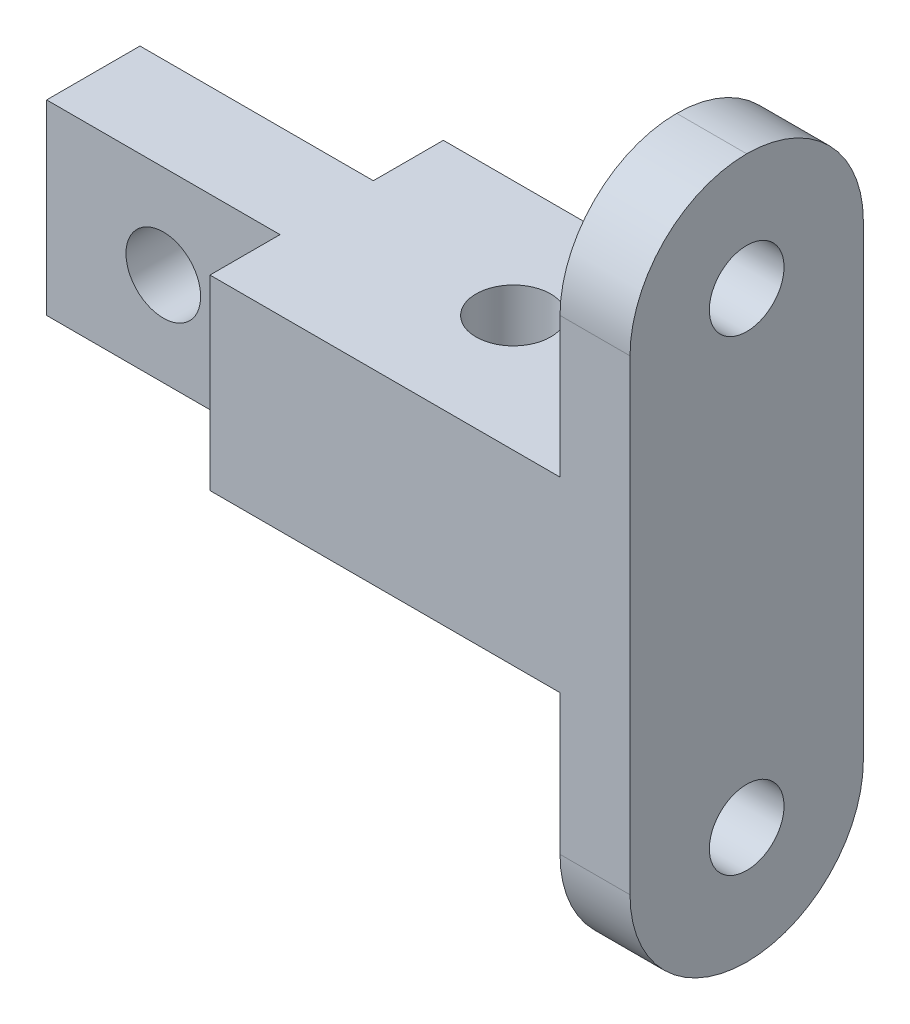
ISO-10303-21;
HEADER;
FILE_DESCRIPTION(('STEP AP214'),'2;1');
FILE_NAME('part.step','',(''),(''),'','','');
FILE_SCHEMA(('AUTOMOTIVE_DESIGN { 1 0 10303 214 1 1 1 1 }'));
ENDSEC;
DATA;
#1=APPLICATION_CONTEXT('core data for automotive mechanical design processes');
#2=APPLICATION_PROTOCOL_DEFINITION('international standard','automotive_design',2000,#1);
#3=PRODUCT_CONTEXT('',#1,'mechanical');
#4=PRODUCT('Part','Part','',(#3));
#5=PRODUCT_RELATED_PRODUCT_CATEGORY('part','',(#4));
#6=PRODUCT_DEFINITION_FORMATION('','',#4);
#7=PRODUCT_DEFINITION_CONTEXT('part definition',#1,'design');
#8=PRODUCT_DEFINITION('design','',#6,#7);
#9=PRODUCT_DEFINITION_SHAPE('','',#8);
#10=(LENGTH_UNIT() NAMED_UNIT(*) SI_UNIT(.MILLI.,.METRE.));
#11=(NAMED_UNIT(*) PLANE_ANGLE_UNIT() SI_UNIT($,.RADIAN.));
#12=(NAMED_UNIT(*) SI_UNIT($,.STERADIAN.) SOLID_ANGLE_UNIT());
#13=UNCERTAINTY_MEASURE_WITH_UNIT(LENGTH_MEASURE(1.E-05),#10,'distance_accuracy_value','');
#14=(GEOMETRIC_REPRESENTATION_CONTEXT(3) GLOBAL_UNCERTAINTY_ASSIGNED_CONTEXT((#13)) GLOBAL_UNIT_ASSIGNED_CONTEXT((#10,
#11,#12)) REPRESENTATION_CONTEXT('',''));
#15=CARTESIAN_POINT('',(0.,0.,0.));
#16=DIRECTION('',(0.,0.,1.));
#17=DIRECTION('',(1.,0.,0.));
#18=AXIS2_PLACEMENT_3D('',#15,#16,#17);
#19=CARTESIAN_POINT('',(6.,15.,10.));
#20=DIRECTION('',(1.,0.,0.));
#21=DIRECTION('',(0.,1.,0.));
#22=AXIS2_PLACEMENT_3D('',#19,#20,#21);
#23=PLANE('',#22);
#24=CARTESIAN_POINT('',(6.,10.,5.));
#25=DIRECTION('',(-1.,0.,0.));
#26=DIRECTION('',(0.,-1.,0.));
#27=AXIS2_PLACEMENT_3D('',#24,#25,#26);
#28=CIRCLE('',#27,1.6);
#29=CARTESIAN_POINT('',(6.,8.4,5.));
#30=VERTEX_POINT('',#29);
#31=EDGE_CURVE('E193',#30,#30,#28,.T.);
#32=ORIENTED_EDGE('',*,*,#31,.F.);
#33=EDGE_LOOP('',(#32));
#34=FACE_BOUND('',#33,.T.);
#35=CARTESIAN_POINT('',(6.,10.,5.));
#36=DIRECTION('',(1.,0.,0.));
#37=DIRECTION('',(0.,1.,0.));
#38=AXIS2_PLACEMENT_3D('',#35,#36,#37);
#39=CIRCLE('',#38,5.);
#40=CARTESIAN_POINT('',(6.,10.,10.));
#41=VERTEX_POINT('',#40);
#42=CARTESIAN_POINT('',(6.,15.,5.));
#43=VERTEX_POINT('',#42);
#44=EDGE_CURVE('E219',#41,#43,#39,.F.);
#45=ORIENTED_EDGE('',*,*,#44,.T.);
#46=CARTESIAN_POINT('',(6.,10.,5.));
#47=DIRECTION('',(1.,0.,0.));
#48=DIRECTION('',(0.,1.,0.));
#49=AXIS2_PLACEMENT_3D('',#46,#47,#48);
#50=CIRCLE('',#49,5.);
#51=CARTESIAN_POINT('',(6.,10.,0.));
#52=VERTEX_POINT('',#51);
#53=EDGE_CURVE('E221',#43,#52,#50,.F.);
#54=ORIENTED_EDGE('',*,*,#53,.T.);
#55=DIRECTION('',(0.,-1.,0.));
#56=VECTOR('',#55,1.);
#57=CARTESIAN_POINT('',(6.,15.,0.));
#58=LINE('',#57,#56);
#59=CARTESIAN_POINT('',(6.,4.,0.));
#60=VERTEX_POINT('',#59);
#61=EDGE_CURVE('E169',#52,#60,#58,.T.);
#62=ORIENTED_EDGE('',*,*,#61,.T.);
#63=DIRECTION('',(0.,0.,-1.));
#64=VECTOR('',#63,1.);
#65=CARTESIAN_POINT('',(6.,4.,10.));
#66=LINE('',#65,#64);
#67=CARTESIAN_POINT('',(6.,4.,10.));
#68=VERTEX_POINT('',#67);
#69=EDGE_CURVE('E188',#68,#60,#66,.T.);
#70=ORIENTED_EDGE('',*,*,#69,.F.);
#71=DIRECTION('',(0.,-1.,0.));
#72=VECTOR('',#71,1.);
#73=CARTESIAN_POINT('',(6.,15.,10.));
#74=LINE('',#73,#72);
#75=EDGE_CURVE('E154',#41,#68,#74,.T.);
#76=ORIENTED_EDGE('',*,*,#75,.F.);
#77=EDGE_LOOP('',(#45,#54,#62,#70,#76));
#78=FACE_BOUND('',#77,.T.);
#79=ADVANCED_FACE('F33',(#34,#78),#23,.F.);
#80=CARTESIAN_POINT('',(6.,4.,10.));
#81=DIRECTION('',(0.,-1.,0.));
#82=DIRECTION('',(1.,0.,0.));
#83=AXIS2_PLACEMENT_3D('',#80,#81,#82);
#84=PLANE('',#83);
#85=CARTESIAN_POINT('',(-1.,4.,5.));
#86=DIRECTION('',(0.,-1.,0.));
#87=DIRECTION('',(1.,0.,0.));
#88=AXIS2_PLACEMENT_3D('',#85,#86,#87);
#89=CIRCLE('',#88,1.6);
#90=CARTESIAN_POINT('',(0.599999999999997,4.,5.));
#91=VERTEX_POINT('',#90);
#92=EDGE_CURVE('E307',#91,#91,#89,.T.);
#93=ORIENTED_EDGE('',*,*,#92,.T.);
#94=EDGE_LOOP('',(#93));
#95=FACE_BOUND('',#94,.T.);
#96=DIRECTION('',(0.,0.,-1.));
#97=VECTOR('',#96,1.);
#98=CARTESIAN_POINT('',(-19.,4.,10.));
#99=LINE('',#98,#97);
#100=CARTESIAN_POINT('',(-19.,4.,7.));
#101=VERTEX_POINT('',#100);
#102=CARTESIAN_POINT('',(-19.,4.,3.));
#103=VERTEX_POINT('',#102);
#104=EDGE_CURVE('E186',#101,#103,#99,.T.);
#105=ORIENTED_EDGE('',*,*,#104,.F.);
#106=DIRECTION('',(-1.,0.,0.));
#107=VECTOR('',#106,1.);
#108=CARTESIAN_POINT('',(-19.,4.,7.));
#109=LINE('',#108,#107);
#110=CARTESIAN_POINT('',(-9.,4.,7.));
#111=VERTEX_POINT('',#110);
#112=EDGE_CURVE('E150',#111,#101,#109,.T.);
#113=ORIENTED_EDGE('',*,*,#112,.F.);
#114=DIRECTION('',(0.,0.,-1.));
#115=VECTOR('',#114,1.);
#116=CARTESIAN_POINT('',(-9.,4.,10.));
#117=LINE('',#116,#115);
#118=CARTESIAN_POINT('',(-9.,4.,10.));
#119=VERTEX_POINT('',#118);
#120=EDGE_CURVE('E136',#119,#111,#117,.T.);
#121=ORIENTED_EDGE('',*,*,#120,.F.);
#122=DIRECTION('',(-1.,0.,0.));
#123=VECTOR('',#122,1.);
#124=CARTESIAN_POINT('',(6.,4.,10.));
#125=LINE('',#124,#123);
#126=EDGE_CURVE('E148',#68,#119,#125,.T.);
#127=ORIENTED_EDGE('',*,*,#126,.F.);
#128=ORIENTED_EDGE('',*,*,#69,.T.);
#129=DIRECTION('',(-1.,0.,0.));
#130=VECTOR('',#129,1.);
#131=CARTESIAN_POINT('',(6.,4.,0.));
#132=LINE('',#131,#130);
#133=CARTESIAN_POINT('',(-9.,4.,0.));
#134=VERTEX_POINT('',#133);
#135=EDGE_CURVE('E171',#60,#134,#132,.T.);
#136=ORIENTED_EDGE('',*,*,#135,.T.);
#137=DIRECTION('',(0.,0.,-1.));
#138=VECTOR('',#137,1.);
#139=CARTESIAN_POINT('',(-9.,4.,0.));
#140=LINE('',#139,#138);
#141=CARTESIAN_POINT('',(-9.,4.,3.));
#142=VERTEX_POINT('',#141);
#143=EDGE_CURVE('E57',#142,#134,#140,.T.);
#144=ORIENTED_EDGE('',*,*,#143,.F.);
#145=DIRECTION('',(1.,0.,0.));
#146=VECTOR('',#145,1.);
#147=CARTESIAN_POINT('',(-19.,4.,3.));
#148=LINE('',#147,#146);
#149=EDGE_CURVE('E253',#103,#142,#148,.T.);
#150=ORIENTED_EDGE('',*,*,#149,.F.);
#151=EDGE_LOOP('',(#105,#113,#121,#127,#128,#136,#144,#150));
#152=FACE_BOUND('',#151,.T.);
#153=ADVANCED_FACE('F146',(#95,#152),#84,.F.);
#154=CARTESIAN_POINT('',(-19.,-4.,10.));
#155=DIRECTION('',(1.,0.,0.));
#156=DIRECTION('',(0.,0.,-1.));
#157=AXIS2_PLACEMENT_3D('',#154,#155,#156);
#158=PLANE('',#157);
#159=DIRECTION('',(0.,0.,-1.));
#160=VECTOR('',#159,1.);
#161=CARTESIAN_POINT('',(-19.,-4.,10.));
#162=LINE('',#161,#160);
#163=CARTESIAN_POINT('',(-19.,-4.,7.));
#164=VERTEX_POINT('',#163);
#165=CARTESIAN_POINT('',(-19.,-4.,3.));
#166=VERTEX_POINT('',#165);
#167=EDGE_CURVE('E184',#164,#166,#162,.T.);
#168=ORIENTED_EDGE('',*,*,#167,.F.);
#169=DIRECTION('',(0.,1.,0.));
#170=VECTOR('',#169,1.);
#171=CARTESIAN_POINT('',(-19.,-6.,7.));
#172=LINE('',#171,#170);
#173=EDGE_CURVE('E297',#164,#101,#172,.T.);
#174=ORIENTED_EDGE('',*,*,#173,.T.);
#175=ORIENTED_EDGE('',*,*,#104,.T.);
#176=DIRECTION('',(0.,1.,0.));
#177=VECTOR('',#176,1.);
#178=CARTESIAN_POINT('',(-19.,-6.,3.));
#179=LINE('',#178,#177);
#180=EDGE_CURVE('E245',#166,#103,#179,.T.);
#181=ORIENTED_EDGE('',*,*,#180,.F.);
#182=EDGE_LOOP('',(#168,#174,#175,#181));
#183=FACE_BOUND('',#182,.T.);
#184=ADVANCED_FACE('F249',(#183),#158,.F.);
#185=CARTESIAN_POINT('',(6.,-4.,10.));
#186=DIRECTION('',(0.,1.,0.));
#187=DIRECTION('',(-1.,0.,0.));
#188=AXIS2_PLACEMENT_3D('',#185,#186,#187);
#189=PLANE('',#188);
#190=CARTESIAN_POINT('',(-1.,-4.,5.));
#191=DIRECTION('',(0.,-1.,0.));
#192=DIRECTION('',(1.,0.,0.));
#193=AXIS2_PLACEMENT_3D('',#190,#191,#192);
#194=CIRCLE('',#193,1.6);
#195=CARTESIAN_POINT('',(0.599999999999998,-4.,5.));
#196=VERTEX_POINT('',#195);
#197=EDGE_CURVE('E310',#196,#196,#194,.T.);
#198=ORIENTED_EDGE('',*,*,#197,.F.);
#199=EDGE_LOOP('',(#198));
#200=FACE_BOUND('',#199,.T.);
#201=DIRECTION('',(0.,0.,-1.));
#202=VECTOR('',#201,1.);
#203=CARTESIAN_POINT('',(-9.,-4.,10.));
#204=LINE('',#203,#202);
#205=CARTESIAN_POINT('',(-9.,-4.,10.));
#206=VERTEX_POINT('',#205);
#207=CARTESIAN_POINT('',(-9.,-4.,7.));
#208=VERTEX_POINT('',#207);
#209=EDGE_CURVE('E49',#206,#208,#204,.T.);
#210=ORIENTED_EDGE('',*,*,#209,.T.);
#211=DIRECTION('',(-1.,0.,0.));
#212=VECTOR('',#211,1.);
#213=CARTESIAN_POINT('',(6.,-4.,7.));
#214=LINE('',#213,#212);
#215=EDGE_CURVE('E11',#208,#164,#214,.T.);
#216=ORIENTED_EDGE('',*,*,#215,.T.);
#217=ORIENTED_EDGE('',*,*,#167,.T.);
#218=DIRECTION('',(1.,0.,0.));
#219=VECTOR('',#218,1.);
#220=CARTESIAN_POINT('',(6.,-4.,3.));
#221=LINE('',#220,#219);
#222=CARTESIAN_POINT('',(-9.,-4.,3.));
#223=VERTEX_POINT('',#222);
#224=EDGE_CURVE('E141',#166,#223,#221,.T.);
#225=ORIENTED_EDGE('',*,*,#224,.T.);
#226=DIRECTION('',(0.,0.,-1.));
#227=VECTOR('',#226,1.);
#228=CARTESIAN_POINT('',(-9.,-4.,10.));
#229=LINE('',#228,#227);
#230=CARTESIAN_POINT('',(-9.,-4.,0.));
#231=VERTEX_POINT('',#230);
#232=EDGE_CURVE('E230',#223,#231,#229,.T.);
#233=ORIENTED_EDGE('',*,*,#232,.T.);
#234=DIRECTION('',(1.,0.,0.));
#235=VECTOR('',#234,1.);
#236=CARTESIAN_POINT('',(6.,-4.,0.));
#237=LINE('',#236,#235);
#238=CARTESIAN_POINT('',(6.,-4.,0.));
#239=VERTEX_POINT('',#238);
#240=EDGE_CURVE('E175',#231,#239,#237,.T.);
#241=ORIENTED_EDGE('',*,*,#240,.T.);
#242=DIRECTION('',(0.,0.,-1.));
#243=VECTOR('',#242,1.);
#244=CARTESIAN_POINT('',(6.,-4.,10.));
#245=LINE('',#244,#243);
#246=CARTESIAN_POINT('',(6.,-4.,10.));
#247=VERTEX_POINT('',#246);
#248=EDGE_CURVE('E168',#247,#239,#245,.T.);
#249=ORIENTED_EDGE('',*,*,#248,.F.);
#250=DIRECTION('',(1.,0.,0.));
#251=VECTOR('',#250,1.);
#252=CARTESIAN_POINT('',(6.,-4.,10.));
#253=LINE('',#252,#251);
#254=EDGE_CURVE('E155',#206,#247,#253,.T.);
#255=ORIENTED_EDGE('',*,*,#254,.F.);
#256=EDGE_LOOP('',(#210,#216,#217,#225,#233,#241,#249,#255));
#257=FACE_BOUND('',#256,.T.);
#258=ADVANCED_FACE('F236',(#200,#257),#189,.F.);
#259=CARTESIAN_POINT('',(6.,-4.,10.));
#260=DIRECTION('',(1.,0.,0.));
#261=DIRECTION('',(0.,1.,0.));
#262=AXIS2_PLACEMENT_3D('',#259,#260,#261);
#263=PLANE('',#262);
#264=CARTESIAN_POINT('',(6.,-10.,5.));
#265=DIRECTION('',(1.,0.,0.));
#266=DIRECTION('',(0.,1.,0.));
#267=AXIS2_PLACEMENT_3D('',#264,#265,#266);
#268=CIRCLE('',#267,1.6);
#269=CARTESIAN_POINT('',(6.,-8.4,5.));
#270=VERTEX_POINT('',#269);
#271=EDGE_CURVE('E197',#270,#270,#268,.T.);
#272=ORIENTED_EDGE('',*,*,#271,.T.);
#273=EDGE_LOOP('',(#272));
#274=FACE_BOUND('',#273,.T.);
#275=DIRECTION('',(0.,-1.,0.));
#276=VECTOR('',#275,1.);
#277=CARTESIAN_POINT('',(6.,-4.,0.));
#278=LINE('',#277,#276);
#279=CARTESIAN_POINT('',(6.,-9.99999999999998,0.));
#280=VERTEX_POINT('',#279);
#281=EDGE_CURVE('E177',#239,#280,#278,.T.);
#282=ORIENTED_EDGE('',*,*,#281,.T.);
#283=CARTESIAN_POINT('',(6.,-9.99999999999998,5.));
#284=DIRECTION('',(1.,0.,0.));
#285=DIRECTION('',(0.,1.,0.));
#286=AXIS2_PLACEMENT_3D('',#283,#284,#285);
#287=CIRCLE('',#286,5.);
#288=CARTESIAN_POINT('',(6.,-15.,5.));
#289=VERTEX_POINT('',#288);
#290=EDGE_CURVE('E213',#280,#289,#287,.F.);
#291=ORIENTED_EDGE('',*,*,#290,.T.);
#292=CARTESIAN_POINT('',(6.,-9.99999999999998,5.));
#293=DIRECTION('',(1.,0.,0.));
#294=DIRECTION('',(0.,1.,0.));
#295=AXIS2_PLACEMENT_3D('',#292,#293,#294);
#296=CIRCLE('',#295,5.);
#297=CARTESIAN_POINT('',(6.,-9.99999999999998,10.));
#298=VERTEX_POINT('',#297);
#299=EDGE_CURVE('E211',#289,#298,#296,.F.);
#300=ORIENTED_EDGE('',*,*,#299,.T.);
#301=DIRECTION('',(0.,-1.,0.));
#302=VECTOR('',#301,1.);
#303=CARTESIAN_POINT('',(6.,-4.,10.));
#304=LINE('',#303,#302);
#305=EDGE_CURVE('E157',#247,#298,#304,.T.);
#306=ORIENTED_EDGE('',*,*,#305,.F.);
#307=ORIENTED_EDGE('',*,*,#248,.T.);
#308=EDGE_LOOP('',(#282,#291,#300,#306,#307));
#309=FACE_BOUND('',#308,.T.);
#310=ADVANCED_FACE('F292',(#274,#309),#263,.F.);
#311=CARTESIAN_POINT('',(9.,15.,10.));
#312=DIRECTION('',(-1.,0.,0.));
#313=DIRECTION('',(0.,-1.,0.));
#314=AXIS2_PLACEMENT_3D('',#311,#312,#313);
#315=PLANE('',#314);
#316=CARTESIAN_POINT('',(9.,-10.,5.));
#317=DIRECTION('',(-1.,0.,0.));
#318=DIRECTION('',(0.,-1.,0.));
#319=AXIS2_PLACEMENT_3D('',#316,#317,#318);
#320=CIRCLE('',#319,1.6);
#321=CARTESIAN_POINT('',(9.,-11.6,5.));
#322=VERTEX_POINT('',#321);
#323=EDGE_CURVE('E194',#322,#322,#320,.F.);
#324=ORIENTED_EDGE('',*,*,#323,.F.);
#325=EDGE_LOOP('',(#324));
#326=FACE_BOUND('',#325,.T.);
#327=CARTESIAN_POINT('',(9.,10.,5.));
#328=DIRECTION('',(-1.,0.,0.));
#329=DIRECTION('',(0.,-1.,0.));
#330=AXIS2_PLACEMENT_3D('',#327,#328,#329);
#331=CIRCLE('',#330,1.6);
#332=CARTESIAN_POINT('',(9.,8.4,5.));
#333=VERTEX_POINT('',#332);
#334=EDGE_CURVE('E172',#333,#333,#331,.T.);
#335=ORIENTED_EDGE('',*,*,#334,.T.);
#336=EDGE_LOOP('',(#335));
#337=FACE_BOUND('',#336,.T.);
#338=CARTESIAN_POINT('',(9.,-9.99999999999998,5.));
#339=DIRECTION('',(-1.,0.,0.));
#340=DIRECTION('',(0.,-1.,0.));
#341=AXIS2_PLACEMENT_3D('',#338,#339,#340);
#342=CIRCLE('',#341,5.);
#343=CARTESIAN_POINT('',(9.,-9.99999999999998,10.));
#344=VERTEX_POINT('',#343);
#345=CARTESIAN_POINT('',(9.,-15.,5.));
#346=VERTEX_POINT('',#345);
#347=EDGE_CURVE('E201',#344,#346,#342,.F.);
#348=ORIENTED_EDGE('',*,*,#347,.T.);
#349=CARTESIAN_POINT('',(9.,-9.99999999999998,5.));
#350=DIRECTION('',(-1.,0.,0.));
#351=DIRECTION('',(0.,-1.,0.));
#352=AXIS2_PLACEMENT_3D('',#349,#350,#351);
#353=CIRCLE('',#352,5.);
#354=CARTESIAN_POINT('',(9.,-9.99999999999998,0.));
#355=VERTEX_POINT('',#354);
#356=EDGE_CURVE('E203',#346,#355,#353,.F.);
#357=ORIENTED_EDGE('',*,*,#356,.T.);
#358=DIRECTION('',(0.,1.,0.));
#359=VECTOR('',#358,1.);
#360=CARTESIAN_POINT('',(9.,15.,0.));
#361=LINE('',#360,#359);
#362=CARTESIAN_POINT('',(9.,10.,0.));
#363=VERTEX_POINT('',#362);
#364=EDGE_CURVE('E159',#355,#363,#361,.T.);
#365=ORIENTED_EDGE('',*,*,#364,.T.);
#366=CARTESIAN_POINT('',(9.,10.,5.));
#367=DIRECTION('',(-1.,0.,0.));
#368=DIRECTION('',(0.,-1.,0.));
#369=AXIS2_PLACEMENT_3D('',#366,#367,#368);
#370=CIRCLE('',#369,5.);
#371=CARTESIAN_POINT('',(9.,15.,5.));
#372=VERTEX_POINT('',#371);
#373=EDGE_CURVE('E199',#363,#372,#370,.F.);
#374=ORIENTED_EDGE('',*,*,#373,.T.);
#375=CARTESIAN_POINT('',(9.,10.,5.));
#376=DIRECTION('',(-1.,0.,0.));
#377=DIRECTION('',(0.,-1.,0.));
#378=AXIS2_PLACEMENT_3D('',#375,#376,#377);
#379=CIRCLE('',#378,5.);
#380=CARTESIAN_POINT('',(9.,10.,10.));
#381=VERTEX_POINT('',#380);
#382=EDGE_CURVE('E190',#372,#381,#379,.F.);
#383=ORIENTED_EDGE('',*,*,#382,.T.);
#384=DIRECTION('',(0.,1.,0.));
#385=VECTOR('',#384,1.);
#386=CARTESIAN_POINT('',(9.,15.,10.));
#387=LINE('',#386,#385);
#388=EDGE_CURVE('E165',#344,#381,#387,.T.);
#389=ORIENTED_EDGE('',*,*,#388,.F.);
#390=EDGE_LOOP('',(#348,#357,#365,#374,#383,#389));
#391=FACE_BOUND('',#390,.T.);
#392=ADVANCED_FACE('F283',(#326,#337,#391),#315,.F.);
#393=CARTESIAN_POINT('',(0.,0.,10.));
#394=DIRECTION('',(0.,0.,-1.));
#395=DIRECTION('',(-1.,0.,0.));
#396=AXIS2_PLACEMENT_3D('',#393,#394,#395);
#397=PLANE('',#396);
#398=ORIENTED_EDGE('',*,*,#126,.T.);
#399=DIRECTION('',(0.,-1.,0.));
#400=VECTOR('',#399,1.);
#401=CARTESIAN_POINT('',(-9.,0.,10.));
#402=LINE('',#401,#400);
#403=EDGE_CURVE('E42',#119,#206,#402,.T.);
#404=ORIENTED_EDGE('',*,*,#403,.T.);
#405=ORIENTED_EDGE('',*,*,#254,.T.);
#406=ORIENTED_EDGE('',*,*,#305,.T.);
#407=DIRECTION('',(1.,0.,0.));
#408=VECTOR('',#407,1.);
#409=CARTESIAN_POINT('',(0.,-9.99999999999998,10.));
#410=LINE('',#409,#408);
#411=EDGE_CURVE('E217',#298,#344,#410,.T.);
#412=ORIENTED_EDGE('',*,*,#411,.T.);
#413=ORIENTED_EDGE('',*,*,#388,.T.);
#414=DIRECTION('',(-1.,0.,0.));
#415=VECTOR('',#414,1.);
#416=CARTESIAN_POINT('',(0.,10.,10.));
#417=LINE('',#416,#415);
#418=EDGE_CURVE('E215',#381,#41,#417,.T.);
#419=ORIENTED_EDGE('',*,*,#418,.T.);
#420=ORIENTED_EDGE('',*,*,#75,.T.);
#421=EDGE_LOOP('',(#398,#404,#405,#406,#412,#413,#419,#420));
#422=FACE_BOUND('',#421,.T.);
#423=ADVANCED_FACE('F152',(#422),#397,.F.);
#424=CARTESIAN_POINT('',(0.,0.,0.));
#425=DIRECTION('',(0.,0.,-1.));
#426=DIRECTION('',(-1.,0.,0.));
#427=AXIS2_PLACEMENT_3D('',#424,#425,#426);
#428=PLANE('',#427);
#429=DIRECTION('',(0.,-1.,0.));
#430=VECTOR('',#429,1.);
#431=CARTESIAN_POINT('',(-9.,0.,0.));
#432=LINE('',#431,#430);
#433=EDGE_CURVE('E223',#134,#231,#432,.T.);
#434=ORIENTED_EDGE('',*,*,#433,.F.);
#435=ORIENTED_EDGE('',*,*,#135,.F.);
#436=ORIENTED_EDGE('',*,*,#61,.F.);
#437=DIRECTION('',(-1.,0.,0.));
#438=VECTOR('',#437,1.);
#439=CARTESIAN_POINT('',(9.,10.,0.));
#440=LINE('',#439,#438);
#441=EDGE_CURVE('E205',#52,#363,#440,.F.);
#442=ORIENTED_EDGE('',*,*,#441,.T.);
#443=ORIENTED_EDGE('',*,*,#364,.F.);
#444=DIRECTION('',(1.,0.,0.));
#445=VECTOR('',#444,1.);
#446=CARTESIAN_POINT('',(6.,-9.99999999999998,0.));
#447=LINE('',#446,#445);
#448=EDGE_CURVE('E208',#355,#280,#447,.F.);
#449=ORIENTED_EDGE('',*,*,#448,.T.);
#450=ORIENTED_EDGE('',*,*,#281,.F.);
#451=ORIENTED_EDGE('',*,*,#240,.F.);
#452=EDGE_LOOP('',(#434,#435,#436,#442,#443,#449,#450,#451));
#453=FACE_BOUND('',#452,.T.);
#454=ADVANCED_FACE('F279',(#453),#428,.T.);
#455=CARTESIAN_POINT('',(16.,10.,5.));
#456=DIRECTION('',(-1.,0.,0.));
#457=DIRECTION('',(0.,-1.,0.));
#458=AXIS2_PLACEMENT_3D('',#455,#456,#457);
#459=CYLINDRICAL_SURFACE('',#458,1.6);
#460=ORIENTED_EDGE('',*,*,#31,.T.);
#461=EDGE_LOOP('',(#460));
#462=FACE_BOUND('',#461,.T.);
#463=ORIENTED_EDGE('',*,*,#334,.F.);
#464=EDGE_LOOP('',(#463));
#465=FACE_BOUND('',#464,.T.);
#466=ADVANCED_FACE('F261',(#462,#465),#459,.F.);
#467=CARTESIAN_POINT('',(16.,-10.,5.));
#468=DIRECTION('',(-1.,0.,0.));
#469=DIRECTION('',(0.,-1.,0.));
#470=AXIS2_PLACEMENT_3D('',#467,#468,#469);
#471=CYLINDRICAL_SURFACE('',#470,1.6);
#472=ORIENTED_EDGE('',*,*,#271,.F.);
#473=EDGE_LOOP('',(#472));
#474=FACE_BOUND('',#473,.T.);
#475=ORIENTED_EDGE('',*,*,#323,.T.);
#476=EDGE_LOOP('',(#475));
#477=FACE_BOUND('',#476,.T.);
#478=ADVANCED_FACE('F336',(#474,#477),#471,.F.);
#479=CARTESIAN_POINT('',(0.,-9.99999999999998,5.));
#480=DIRECTION('',(1.,0.,0.));
#481=DIRECTION('',(0.,0.,-1.));
#482=AXIS2_PLACEMENT_3D('',#479,#480,#481);
#483=CYLINDRICAL_SURFACE('',#482,5.);
#484=ORIENTED_EDGE('',*,*,#411,.F.);
#485=ORIENTED_EDGE('',*,*,#299,.F.);
#486=DIRECTION('',(1.,0.,0.));
#487=VECTOR('',#486,1.);
#488=CARTESIAN_POINT('',(6.,-15.,5.));
#489=LINE('',#488,#487);
#490=EDGE_CURVE('E224',#346,#289,#489,.F.);
#491=ORIENTED_EDGE('',*,*,#490,.F.);
#492=ORIENTED_EDGE('',*,*,#347,.F.);
#493=EDGE_LOOP('',(#484,#485,#491,#492));
#494=FACE_BOUND('',#493,.T.);
#495=ADVANCED_FACE('F334',(#494),#483,.T.);
#496=CARTESIAN_POINT('',(6.,-9.99999999999998,5.));
#497=DIRECTION('',(-1.,0.,0.));
#498=DIRECTION('',(0.,0.,1.));
#499=AXIS2_PLACEMENT_3D('',#496,#497,#498);
#500=CYLINDRICAL_SURFACE('',#499,5.);
#501=ORIENTED_EDGE('',*,*,#290,.F.);
#502=ORIENTED_EDGE('',*,*,#448,.F.);
#503=ORIENTED_EDGE('',*,*,#356,.F.);
#504=ORIENTED_EDGE('',*,*,#490,.T.);
#505=EDGE_LOOP('',(#501,#502,#503,#504));
#506=FACE_BOUND('',#505,.T.);
#507=ADVANCED_FACE('F289',(#506),#500,.T.);
#508=CARTESIAN_POINT('',(0.,10.,5.));
#509=DIRECTION('',(-1.,0.,0.));
#510=DIRECTION('',(0.,0.,1.));
#511=AXIS2_PLACEMENT_3D('',#508,#509,#510);
#512=CYLINDRICAL_SURFACE('',#511,5.);
#513=ORIENTED_EDGE('',*,*,#418,.F.);
#514=ORIENTED_EDGE('',*,*,#382,.F.);
#515=DIRECTION('',(-1.,0.,0.));
#516=VECTOR('',#515,1.);
#517=CARTESIAN_POINT('',(6.,15.,5.));
#518=LINE('',#517,#516);
#519=EDGE_CURVE('E227',#43,#372,#518,.F.);
#520=ORIENTED_EDGE('',*,*,#519,.F.);
#521=ORIENTED_EDGE('',*,*,#44,.F.);
#522=EDGE_LOOP('',(#513,#514,#520,#521));
#523=FACE_BOUND('',#522,.T.);
#524=ADVANCED_FACE('F35',(#523),#512,.T.);
#525=CARTESIAN_POINT('',(6.,10.,5.));
#526=DIRECTION('',(1.,0.,0.));
#527=DIRECTION('',(0.,0.,-1.));
#528=AXIS2_PLACEMENT_3D('',#525,#526,#527);
#529=CYLINDRICAL_SURFACE('',#528,5.);
#530=ORIENTED_EDGE('',*,*,#373,.F.);
#531=ORIENTED_EDGE('',*,*,#441,.F.);
#532=ORIENTED_EDGE('',*,*,#53,.F.);
#533=ORIENTED_EDGE('',*,*,#519,.T.);
#534=EDGE_LOOP('',(#530,#531,#532,#533));
#535=FACE_BOUND('',#534,.T.);
#536=ADVANCED_FACE('F276',(#535),#529,.T.);
#537=CARTESIAN_POINT('',(-19.,-6.,3.));
#538=DIRECTION('',(0.,0.,1.));
#539=DIRECTION('',(1.,0.,0.));
#540=AXIS2_PLACEMENT_3D('',#537,#538,#539);
#541=PLANE('',#540);
#542=CARTESIAN_POINT('',(-14.,0.,3.));
#543=DIRECTION('',(0.,0.,-1.));
#544=DIRECTION('',(-1.,0.,0.));
#545=AXIS2_PLACEMENT_3D('',#542,#543,#544);
#546=CIRCLE('',#545,1.6);
#547=CARTESIAN_POINT('',(-15.6,0.,3.));
#548=VERTEX_POINT('',#547);
#549=EDGE_CURVE('E304',#548,#548,#546,.T.);
#550=ORIENTED_EDGE('',*,*,#549,.F.);
#551=EDGE_LOOP('',(#550));
#552=FACE_BOUND('',#551,.T.);
#553=ORIENTED_EDGE('',*,*,#180,.T.);
#554=ORIENTED_EDGE('',*,*,#149,.T.);
#555=DIRECTION('',(0.,1.,0.));
#556=VECTOR('',#555,1.);
#557=CARTESIAN_POINT('',(-9.,-6.,3.));
#558=LINE('',#557,#556);
#559=EDGE_CURVE('E247',#223,#142,#558,.T.);
#560=ORIENTED_EDGE('',*,*,#559,.F.);
#561=ORIENTED_EDGE('',*,*,#224,.F.);
#562=EDGE_LOOP('',(#553,#554,#560,#561));
#563=FACE_BOUND('',#562,.T.);
#564=ADVANCED_FACE('F243',(#552,#563),#541,.F.);
#565=CARTESIAN_POINT('',(-9.,-6.,0.));
#566=DIRECTION('',(1.,0.,0.));
#567=DIRECTION('',(0.,1.,0.));
#568=AXIS2_PLACEMENT_3D('',#565,#566,#567);
#569=PLANE('',#568);
#570=ORIENTED_EDGE('',*,*,#559,.T.);
#571=ORIENTED_EDGE('',*,*,#143,.T.);
#572=ORIENTED_EDGE('',*,*,#433,.T.);
#573=ORIENTED_EDGE('',*,*,#232,.F.);
#574=EDGE_LOOP('',(#570,#571,#572,#573));
#575=FACE_BOUND('',#574,.T.);
#576=ADVANCED_FACE('F343',(#575),#569,.F.);
#577=CARTESIAN_POINT('',(-19.,-6.,7.));
#578=DIRECTION('',(0.,0.,-1.));
#579=DIRECTION('',(-1.,0.,0.));
#580=AXIS2_PLACEMENT_3D('',#577,#578,#579);
#581=PLANE('',#580);
#582=CARTESIAN_POINT('',(-14.,0.,7.));
#583=DIRECTION('',(0.,0.,-1.));
#584=DIRECTION('',(-1.,0.,0.));
#585=AXIS2_PLACEMENT_3D('',#582,#583,#584);
#586=CIRCLE('',#585,1.6);
#587=CARTESIAN_POINT('',(-15.6,0.,7.));
#588=VERTEX_POINT('',#587);
#589=EDGE_CURVE('E37',#588,#588,#586,.T.);
#590=ORIENTED_EDGE('',*,*,#589,.T.);
#591=EDGE_LOOP('',(#590));
#592=FACE_BOUND('',#591,.T.);
#593=DIRECTION('',(0.,1.,0.));
#594=VECTOR('',#593,1.);
#595=CARTESIAN_POINT('',(-9.,-6.,7.));
#596=LINE('',#595,#594);
#597=EDGE_CURVE('E300',#208,#111,#596,.T.);
#598=ORIENTED_EDGE('',*,*,#597,.T.);
#599=ORIENTED_EDGE('',*,*,#112,.T.);
#600=ORIENTED_EDGE('',*,*,#173,.F.);
#601=ORIENTED_EDGE('',*,*,#215,.F.);
#602=EDGE_LOOP('',(#598,#599,#600,#601));
#603=FACE_BOUND('',#602,.T.);
#604=ADVANCED_FACE('F429',(#592,#603),#581,.F.);
#605=CARTESIAN_POINT('',(-9.,-6.,10.));
#606=DIRECTION('',(1.,0.,0.));
#607=DIRECTION('',(0.,1.,0.));
#608=AXIS2_PLACEMENT_3D('',#605,#606,#607);
#609=PLANE('',#608);
#610=ORIENTED_EDGE('',*,*,#403,.F.);
#611=ORIENTED_EDGE('',*,*,#120,.T.);
#612=ORIENTED_EDGE('',*,*,#597,.F.);
#613=ORIENTED_EDGE('',*,*,#209,.F.);
#614=EDGE_LOOP('',(#610,#611,#612,#613));
#615=FACE_BOUND('',#614,.T.);
#616=ADVANCED_FACE('F135',(#615),#609,.F.);
#617=CARTESIAN_POINT('',(-14.,0.,13.));
#618=DIRECTION('',(0.,0.,-1.));
#619=DIRECTION('',(-1.,0.,0.));
#620=AXIS2_PLACEMENT_3D('',#617,#618,#619);
#621=CYLINDRICAL_SURFACE('',#620,1.6);
#622=ORIENTED_EDGE('',*,*,#549,.T.);
#623=EDGE_LOOP('',(#622));
#624=FACE_BOUND('',#623,.T.);
#625=ORIENTED_EDGE('',*,*,#589,.F.);
#626=EDGE_LOOP('',(#625));
#627=FACE_BOUND('',#626,.T.);
#628=ADVANCED_FACE('F415',(#624,#627),#621,.F.);
#629=CARTESIAN_POINT('',(-1.,6.,5.));
#630=DIRECTION('',(0.,-1.,0.));
#631=DIRECTION('',(1.,0.,0.));
#632=AXIS2_PLACEMENT_3D('',#629,#630,#631);
#633=CYLINDRICAL_SURFACE('',#632,1.6);
#634=ORIENTED_EDGE('',*,*,#197,.T.);
#635=EDGE_LOOP('',(#634));
#636=FACE_BOUND('',#635,.T.);
#637=ORIENTED_EDGE('',*,*,#92,.F.);
#638=EDGE_LOOP('',(#637));
#639=FACE_BOUND('',#638,.T.);
#640=ADVANCED_FACE('F314',(#636,#639),#633,.F.);
#641=CLOSED_SHELL('',(#79,#153,#184,#258,#310,#392,#423,#454,#466,#478,#495,#507,#524,#536,#564,
#576,#604,#616,#628,#640));
#642=MANIFOLD_SOLID_BREP('B2',#641);
#643=ADVANCED_BREP_SHAPE_REPRESENTATION('',(#18,#642),#14);
#644=SHAPE_DEFINITION_REPRESENTATION(#9,#643);
ENDSEC;
END-ISO-10303-21;
